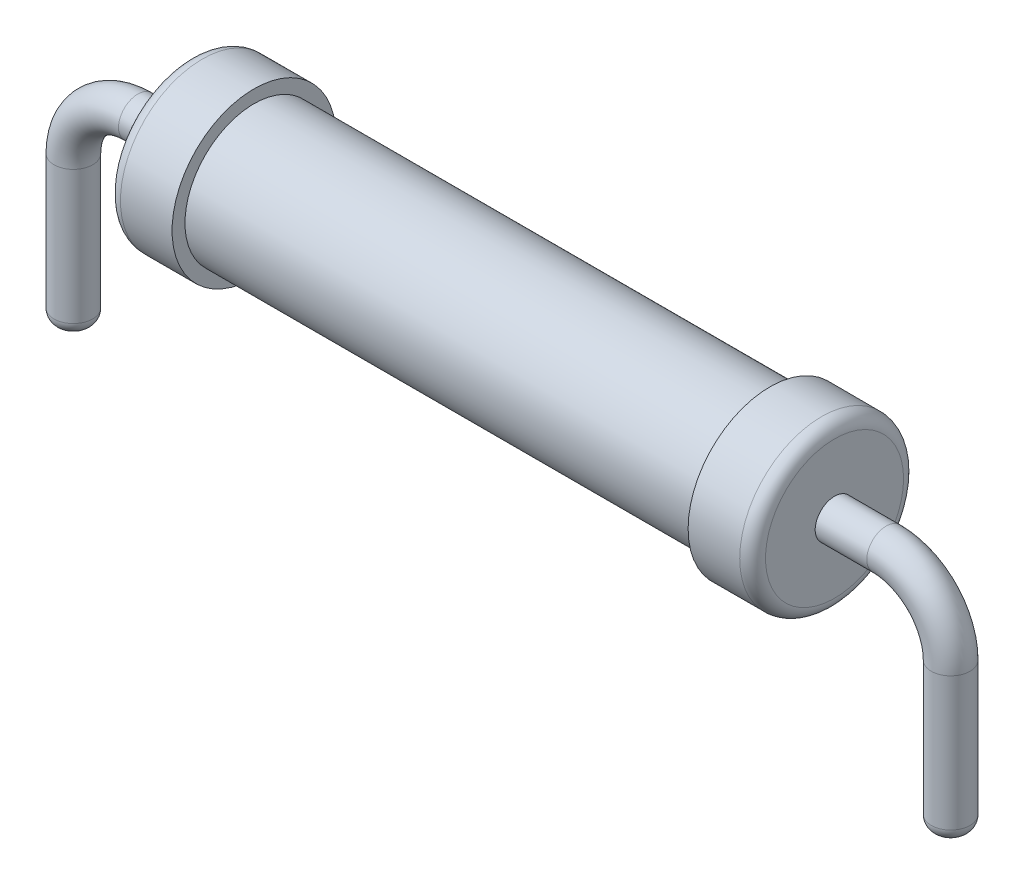
ISO-10303-21;
HEADER;
FILE_DESCRIPTION(('STEP AP214'),'2;1');
FILE_NAME('part.step','',(''),(''),'','','');
FILE_SCHEMA(('AUTOMOTIVE_DESIGN { 1 0 10303 214 1 1 1 1 }'));
ENDSEC;
DATA;
#1=APPLICATION_CONTEXT('core data for automotive mechanical design processes');
#2=APPLICATION_PROTOCOL_DEFINITION('international standard','automotive_design',2000,#1);
#3=PRODUCT_CONTEXT('',#1,'mechanical');
#4=PRODUCT('Part','Part','',(#3));
#5=PRODUCT_RELATED_PRODUCT_CATEGORY('part','',(#4));
#6=PRODUCT_DEFINITION_FORMATION('','',#4);
#7=PRODUCT_DEFINITION_CONTEXT('part definition',#1,'design');
#8=PRODUCT_DEFINITION('design','',#6,#7);
#9=PRODUCT_DEFINITION_SHAPE('','',#8);
#10=(LENGTH_UNIT() NAMED_UNIT(*) SI_UNIT(.MILLI.,.METRE.));
#11=(NAMED_UNIT(*) PLANE_ANGLE_UNIT() SI_UNIT($,.RADIAN.));
#12=(NAMED_UNIT(*) SI_UNIT($,.STERADIAN.) SOLID_ANGLE_UNIT());
#13=UNCERTAINTY_MEASURE_WITH_UNIT(LENGTH_MEASURE(1.E-05),#10,'distance_accuracy_value','');
#14=(GEOMETRIC_REPRESENTATION_CONTEXT(3) GLOBAL_UNCERTAINTY_ASSIGNED_CONTEXT((#13)) GLOBAL_UNIT_ASSIGNED_CONTEXT((#10,
#11,#12)) REPRESENTATION_CONTEXT('',''));
#15=CARTESIAN_POINT('',(0.,0.,0.));
#16=DIRECTION('',(0.,0.,1.));
#17=DIRECTION('',(1.,0.,0.));
#18=AXIS2_PLACEMENT_3D('',#15,#16,#17);
#19=CARTESIAN_POINT('',(5.,0.,0.));
#20=DIRECTION('',(-1.,0.,0.));
#21=DIRECTION('',(0.,0.,1.));
#22=AXIS2_PLACEMENT_3D('',#19,#20,#21);
#23=CYLINDRICAL_SURFACE('',#22,1.27);
#24=CARTESIAN_POINT('',(-4.8,0.,0.));
#25=DIRECTION('',(1.,0.,0.));
#26=DIRECTION('',(0.,0.,-1.));
#27=AXIS2_PLACEMENT_3D('',#24,#25,#26);
#28=CIRCLE('',#27,1.27);
#29=CARTESIAN_POINT('',(-4.8,0.,-1.27));
#30=VERTEX_POINT('',#29);
#31=EDGE_CURVE('E86',#30,#30,#28,.T.);
#32=ORIENTED_EDGE('',*,*,#31,.T.);
#33=EDGE_LOOP('',(#32));
#34=FACE_BOUND('',#33,.T.);
#35=CARTESIAN_POINT('',(-4.,0.,0.));
#36=DIRECTION('',(1.,0.,0.));
#37=DIRECTION('',(0.,0.,-1.));
#38=AXIS2_PLACEMENT_3D('',#35,#36,#37);
#39=CIRCLE('',#38,1.27);
#40=CARTESIAN_POINT('',(-4.,0.,-1.27));
#41=VERTEX_POINT('',#40);
#42=EDGE_CURVE('E37',#41,#41,#39,.T.);
#43=ORIENTED_EDGE('',*,*,#42,.F.);
#44=EDGE_LOOP('',(#43));
#45=FACE_BOUND('',#44,.T.);
#46=ADVANCED_FACE('F33',(#34,#45),#23,.T.);
#47=CARTESIAN_POINT('',(-5.,0.,0.));
#48=DIRECTION('',(1.,0.,0.));
#49=DIRECTION('',(0.,0.,-1.));
#50=AXIS2_PLACEMENT_3D('',#47,#48,#49);
#51=PLANE('',#50);
#52=CARTESIAN_POINT('',(-5.,0.,0.));
#53=DIRECTION('',(1.,0.,0.));
#54=DIRECTION('',(0.,0.,-1.));
#55=AXIS2_PLACEMENT_3D('',#52,#53,#54);
#56=CIRCLE('',#55,0.3);
#57=CARTESIAN_POINT('',(-5.,0.,-0.3));
#58=VERTEX_POINT('',#57);
#59=EDGE_CURVE('E55',#58,#58,#56,.F.);
#60=ORIENTED_EDGE('',*,*,#59,.F.);
#61=EDGE_LOOP('',(#60));
#62=FACE_BOUND('',#61,.T.);
#63=CARTESIAN_POINT('',(-5.,0.,0.));
#64=DIRECTION('',(1.,0.,0.));
#65=DIRECTION('',(0.,0.,-1.));
#66=AXIS2_PLACEMENT_3D('',#63,#64,#65);
#67=CIRCLE('',#66,1.07);
#68=CARTESIAN_POINT('',(-5.,0.,-1.07));
#69=VERTEX_POINT('',#68);
#70=EDGE_CURVE('E89',#69,#69,#67,.F.);
#71=ORIENTED_EDGE('',*,*,#70,.T.);
#72=EDGE_LOOP('',(#71));
#73=FACE_BOUND('',#72,.T.);
#74=ADVANCED_FACE('F119',(#62,#73),#51,.F.);
#75=CARTESIAN_POINT('',(-4.8,0.,0.));
#76=DIRECTION('',(1.,0.,0.));
#77=DIRECTION('',(0.,0.,-1.));
#78=AXIS2_PLACEMENT_3D('',#75,#76,#77);
#79=TOROIDAL_SURFACE('',#78,1.07,0.2);
#80=ORIENTED_EDGE('',*,*,#70,.F.);
#81=EDGE_LOOP('',(#80));
#82=FACE_BOUND('',#81,.T.);
#83=ORIENTED_EDGE('',*,*,#31,.F.);
#84=EDGE_LOOP('',(#83));
#85=FACE_BOUND('',#84,.T.);
#86=ADVANCED_FACE('F126',(#82,#85),#79,.T.);
#87=CARTESIAN_POINT('',(-6.8,-3.27,0.));
#88=DIRECTION('',(0.,-1.,0.));
#89=DIRECTION('',(0.,0.,-1.));
#90=AXIS2_PLACEMENT_3D('',#87,#88,#89);
#91=PLANE('',#90);
#92=CARTESIAN_POINT('',(-6.8,-3.27,0.));
#93=DIRECTION('',(0.,-1.,0.));
#94=DIRECTION('',(0.,0.,-1.));
#95=AXIS2_PLACEMENT_3D('',#92,#93,#94);
#96=CIRCLE('',#95,0.1);
#97=CARTESIAN_POINT('',(-6.8,-3.27,-0.1));
#98=VERTEX_POINT('',#97);
#99=EDGE_CURVE('E41',#98,#98,#96,.T.);
#100=ORIENTED_EDGE('',*,*,#99,.T.);
#101=EDGE_LOOP('',(#100));
#102=FACE_BOUND('',#101,.T.);
#103=ADVANCED_FACE('F163',(#102),#91,.T.);
#104=CARTESIAN_POINT('',(-5.,0.,0.));
#105=DIRECTION('',(-1.,0.,0.));
#106=DIRECTION('',(0.,0.,1.));
#107=AXIS2_PLACEMENT_3D('',#104,#105,#106);
#108=CYLINDRICAL_SURFACE('',#107,0.3);
#109=CARTESIAN_POINT('',(-5.79999999999999,0.,0.));
#110=DIRECTION('',(1.,0.,0.));
#111=DIRECTION('',(0.,0.,-1.));
#112=AXIS2_PLACEMENT_3D('',#109,#110,#111);
#113=CIRCLE('',#112,0.3);
#114=CARTESIAN_POINT('',(-5.79999999999999,0.299999999999965,0.));
#115=VERTEX_POINT('',#114);
#116=EDGE_CURVE('E66',#115,#115,#113,.F.);
#117=ORIENTED_EDGE('',*,*,#116,.F.);
#118=EDGE_LOOP('',(#117));
#119=FACE_BOUND('',#118,.T.);
#120=ORIENTED_EDGE('',*,*,#59,.T.);
#121=EDGE_LOOP('',(#120));
#122=FACE_BOUND('',#121,.T.);
#123=ADVANCED_FACE('F216',(#119,#122),#108,.T.);
#124=CARTESIAN_POINT('',(-5.8,-1.,0.));
#125=DIRECTION('',(0.,0.,1.));
#126=DIRECTION('',(1.,0.,0.));
#127=AXIS2_PLACEMENT_3D('',#124,#125,#126);
#128=TOROIDAL_SURFACE('',#127,0.999999999999965,0.3);
#129=CARTESIAN_POINT('',(-6.8,-1.,0.));
#130=DIRECTION('',(0.,1.,0.));
#131=DIRECTION('',(0.,0.,-1.));
#132=AXIS2_PLACEMENT_3D('',#129,#130,#131);
#133=CIRCLE('',#132,0.3);
#134=CARTESIAN_POINT('',(-7.09999999999997,-1.,0.));
#135=VERTEX_POINT('',#134);
#136=EDGE_CURVE('E69',#135,#135,#133,.F.);
#137=CARTESIAN_POINT('',(-5.8,-1.,0.));
#138=DIRECTION('',(0.,0.,1.));
#139=DIRECTION('',(1.,0.,0.));
#140=AXIS2_PLACEMENT_3D('',#137,#138,#139);
#141=CIRCLE('',#140,1.29999999999997);
#142=EDGE_CURVE('',#115,#135,#141,.T.);
#143=ORIENTED_EDGE('',*,*,#116,.T.);
#144=ORIENTED_EDGE('',*,*,#136,.F.);
#145=ORIENTED_EDGE('',*,*,#142,.T.);
#146=ORIENTED_EDGE('',*,*,#142,.F.);
#147=EDGE_LOOP('',(#143,#145,#144,#146));
#148=FACE_BOUND('',#147,.T.);
#149=ADVANCED_FACE('F225',(#148),#128,.T.);
#150=CARTESIAN_POINT('',(-6.8,-1.00000000000001,0.));
#151=DIRECTION('',(0.,-1.,0.));
#152=DIRECTION('',(0.,0.,-1.));
#153=AXIS2_PLACEMENT_3D('',#150,#151,#152);
#154=CYLINDRICAL_SURFACE('',#153,0.3);
#155=CARTESIAN_POINT('',(-6.8,-3.07,0.));
#156=DIRECTION('',(0.,-1.,0.));
#157=DIRECTION('',(0.,0.,-1.));
#158=AXIS2_PLACEMENT_3D('',#155,#156,#157);
#159=CIRCLE('',#158,0.3);
#160=CARTESIAN_POINT('',(-6.8,-3.07,-0.3));
#161=VERTEX_POINT('',#160);
#162=EDGE_CURVE('E10',#161,#161,#159,.F.);
#163=ORIENTED_EDGE('',*,*,#162,.T.);
#164=EDGE_LOOP('',(#163));
#165=FACE_BOUND('',#164,.T.);
#166=ORIENTED_EDGE('',*,*,#136,.T.);
#167=EDGE_LOOP('',(#166));
#168=FACE_BOUND('',#167,.T.);
#169=ADVANCED_FACE('F198',(#165,#168),#154,.T.);
#170=CARTESIAN_POINT('',(-6.8,-3.07,0.));
#171=DIRECTION('',(0.,-1.,0.));
#172=DIRECTION('',(0.,0.,-1.));
#173=AXIS2_PLACEMENT_3D('',#170,#171,#172);
#174=DEGENERATE_TOROIDAL_SURFACE('',#173,0.1,0.2,.T.);
#175=ORIENTED_EDGE('',*,*,#162,.F.);
#176=EDGE_LOOP('',(#175));
#177=FACE_BOUND('',#176,.T.);
#178=ORIENTED_EDGE('',*,*,#99,.F.);
#179=EDGE_LOOP('',(#178));
#180=FACE_BOUND('',#179,.T.);
#181=ADVANCED_FACE('F35',(#177,#180),#174,.T.);
#182=CARTESIAN_POINT('',(-4.,0.,1.07));
#183=DIRECTION('',(1.,0.,0.));
#184=DIRECTION('',(0.,0.,-1.));
#185=AXIS2_PLACEMENT_3D('',#182,#183,#184);
#186=PLANE('',#185);
#187=CARTESIAN_POINT('',(-4.,0.,0.));
#188=DIRECTION('',(1.,0.,0.));
#189=DIRECTION('',(0.,0.,-1.));
#190=AXIS2_PLACEMENT_3D('',#187,#188,#189);
#191=CIRCLE('',#190,1.07);
#192=CARTESIAN_POINT('',(-4.,0.,-1.07));
#193=VERTEX_POINT('',#192);
#194=EDGE_CURVE('E57',#193,#193,#191,.T.);
#195=ORIENTED_EDGE('',*,*,#194,.F.);
#196=EDGE_LOOP('',(#195));
#197=FACE_BOUND('',#196,.T.);
#198=ORIENTED_EDGE('',*,*,#42,.T.);
#199=EDGE_LOOP('',(#198));
#200=FACE_BOUND('',#199,.T.);
#201=ADVANCED_FACE('F250',(#197,#200),#186,.T.);
#202=CARTESIAN_POINT('',(4.,0.,1.07));
#203=DIRECTION('',(-1.,0.,0.));
#204=DIRECTION('',(0.,0.,1.));
#205=AXIS2_PLACEMENT_3D('',#202,#203,#204);
#206=PLANE('',#205);
#207=CARTESIAN_POINT('',(4.,0.,0.));
#208=DIRECTION('',(1.,0.,0.));
#209=DIRECTION('',(0.,0.,-1.));
#210=AXIS2_PLACEMENT_3D('',#207,#208,#209);
#211=CIRCLE('',#210,1.07);
#212=CARTESIAN_POINT('',(4.,0.,-1.07));
#213=VERTEX_POINT('',#212);
#214=EDGE_CURVE('E51',#213,#213,#211,.T.);
#215=ORIENTED_EDGE('',*,*,#214,.T.);
#216=EDGE_LOOP('',(#215));
#217=FACE_BOUND('',#216,.T.);
#218=CARTESIAN_POINT('',(4.,0.,0.));
#219=DIRECTION('',(-1.,0.,0.));
#220=DIRECTION('',(0.,0.,1.));
#221=AXIS2_PLACEMENT_3D('',#218,#219,#220);
#222=CIRCLE('',#221,1.27);
#223=CARTESIAN_POINT('',(4.,0.,1.27));
#224=VERTEX_POINT('',#223);
#225=EDGE_CURVE('E49',#224,#224,#222,.T.);
#226=ORIENTED_EDGE('',*,*,#225,.T.);
#227=EDGE_LOOP('',(#226));
#228=FACE_BOUND('',#227,.T.);
#229=ADVANCED_FACE('F113',(#217,#228),#206,.T.);
#230=CARTESIAN_POINT('',(7.81,0.,0.));
#231=DIRECTION('',(1.,0.,0.));
#232=DIRECTION('',(0.,0.,-1.));
#233=AXIS2_PLACEMENT_3D('',#230,#231,#232);
#234=CYLINDRICAL_SURFACE('',#233,1.07);
#235=ORIENTED_EDGE('',*,*,#194,.T.);
#236=EDGE_LOOP('',(#235));
#237=FACE_BOUND('',#236,.T.);
#238=ORIENTED_EDGE('',*,*,#214,.F.);
#239=EDGE_LOOP('',(#238));
#240=FACE_BOUND('',#239,.T.);
#241=ADVANCED_FACE('F108',(#237,#240),#234,.T.);
#242=CARTESIAN_POINT('',(6.8,-3.27,0.));
#243=DIRECTION('',(0.,-1.,0.));
#244=DIRECTION('',(0.,0.,-1.));
#245=AXIS2_PLACEMENT_3D('',#242,#243,#244);
#246=PLANE('',#245);
#247=CARTESIAN_POINT('',(6.8,-3.27,0.));
#248=DIRECTION('',(0.,-1.,0.));
#249=DIRECTION('',(0.,0.,-1.));
#250=AXIS2_PLACEMENT_3D('',#247,#248,#249);
#251=CIRCLE('',#250,0.1);
#252=CARTESIAN_POINT('',(6.8,-3.27,-0.1));
#253=VERTEX_POINT('',#252);
#254=EDGE_CURVE('E76',#253,#253,#251,.T.);
#255=ORIENTED_EDGE('',*,*,#254,.T.);
#256=EDGE_LOOP('',(#255));
#257=FACE_BOUND('',#256,.T.);
#258=ADVANCED_FACE('F104',(#257),#246,.T.);
#259=CARTESIAN_POINT('',(6.8,-3.07,0.));
#260=DIRECTION('',(0.,-1.,0.));
#261=DIRECTION('',(0.,0.,-1.));
#262=AXIS2_PLACEMENT_3D('',#259,#260,#261);
#263=DEGENERATE_TOROIDAL_SURFACE('',#262,0.1,0.2,.T.);
#264=CARTESIAN_POINT('',(6.8,-3.07,0.));
#265=DIRECTION('',(0.,-1.,0.));
#266=DIRECTION('',(0.,0.,-1.));
#267=AXIS2_PLACEMENT_3D('',#264,#265,#266);
#268=CIRCLE('',#267,0.3);
#269=CARTESIAN_POINT('',(6.8,-3.07,-0.3));
#270=VERTEX_POINT('',#269);
#271=EDGE_CURVE('E46',#270,#270,#268,.F.);
#272=ORIENTED_EDGE('',*,*,#271,.F.);
#273=EDGE_LOOP('',(#272));
#274=FACE_BOUND('',#273,.T.);
#275=ORIENTED_EDGE('',*,*,#254,.F.);
#276=EDGE_LOOP('',(#275));
#277=FACE_BOUND('',#276,.T.);
#278=ADVANCED_FACE('F101',(#274,#277),#263,.T.);
#279=CARTESIAN_POINT('',(6.8,-1.00000000000001,0.));
#280=DIRECTION('',(0.,-1.,0.));
#281=DIRECTION('',(0.,0.,-1.));
#282=AXIS2_PLACEMENT_3D('',#279,#280,#281);
#283=CYLINDRICAL_SURFACE('',#282,0.3);
#284=ORIENTED_EDGE('',*,*,#271,.T.);
#285=EDGE_LOOP('',(#284));
#286=FACE_BOUND('',#285,.T.);
#287=CARTESIAN_POINT('',(6.8,-1.,0.));
#288=DIRECTION('',(0.,-1.,0.));
#289=DIRECTION('',(0.,0.,-1.));
#290=AXIS2_PLACEMENT_3D('',#287,#288,#289);
#291=CIRCLE('',#290,0.3);
#292=CARTESIAN_POINT('',(7.09999999999997,-1.,0.));
#293=VERTEX_POINT('',#292);
#294=EDGE_CURVE('E80',#293,#293,#291,.T.);
#295=ORIENTED_EDGE('',*,*,#294,.T.);
#296=EDGE_LOOP('',(#295));
#297=FACE_BOUND('',#296,.T.);
#298=ADVANCED_FACE('F98',(#286,#297),#283,.T.);
#299=CARTESIAN_POINT('',(5.8,-1.,0.));
#300=DIRECTION('',(0.,0.,-1.));
#301=DIRECTION('',(-1.,0.,0.));
#302=AXIS2_PLACEMENT_3D('',#299,#300,#301);
#303=TOROIDAL_SURFACE('',#302,0.999999999999965,0.3);
#304=CARTESIAN_POINT('',(5.79999999999999,0.,0.));
#305=DIRECTION('',(1.,0.,0.));
#306=DIRECTION('',(0.,0.,-1.));
#307=AXIS2_PLACEMENT_3D('',#304,#305,#306);
#308=CIRCLE('',#307,0.3);
#309=CARTESIAN_POINT('',(5.79999999999999,0.299999999999965,0.));
#310=VERTEX_POINT('',#309);
#311=EDGE_CURVE('E72',#310,#310,#308,.T.);
#312=CARTESIAN_POINT('',(5.8,-1.,0.));
#313=DIRECTION('',(0.,0.,-1.));
#314=DIRECTION('',(-1.,0.,0.));
#315=AXIS2_PLACEMENT_3D('',#312,#313,#314);
#316=CIRCLE('',#315,1.29999999999997);
#317=EDGE_CURVE('',#310,#293,#316,.T.);
#318=ORIENTED_EDGE('',*,*,#311,.T.);
#319=ORIENTED_EDGE('',*,*,#294,.F.);
#320=ORIENTED_EDGE('',*,*,#317,.T.);
#321=ORIENTED_EDGE('',*,*,#317,.F.);
#322=EDGE_LOOP('',(#318,#320,#319,#321));
#323=FACE_BOUND('',#322,.T.);
#324=ADVANCED_FACE('F151',(#323),#303,.T.);
#325=CARTESIAN_POINT('',(5.,0.,0.));
#326=DIRECTION('',(1.,0.,0.));
#327=DIRECTION('',(0.,0.,-1.));
#328=AXIS2_PLACEMENT_3D('',#325,#326,#327);
#329=CYLINDRICAL_SURFACE('',#328,0.3);
#330=ORIENTED_EDGE('',*,*,#311,.F.);
#331=EDGE_LOOP('',(#330));
#332=FACE_BOUND('',#331,.T.);
#333=CARTESIAN_POINT('',(5.,0.,0.));
#334=DIRECTION('',(1.,0.,0.));
#335=DIRECTION('',(0.,0.,-1.));
#336=AXIS2_PLACEMENT_3D('',#333,#334,#335);
#337=CIRCLE('',#336,0.3);
#338=CARTESIAN_POINT('',(5.,0.,-0.3));
#339=VERTEX_POINT('',#338);
#340=EDGE_CURVE('E73',#339,#339,#337,.T.);
#341=ORIENTED_EDGE('',*,*,#340,.T.);
#342=EDGE_LOOP('',(#341));
#343=FACE_BOUND('',#342,.T.);
#344=ADVANCED_FACE('F146',(#332,#343),#329,.T.);
#345=CARTESIAN_POINT('',(5.,0.,0.));
#346=DIRECTION('',(1.,0.,0.));
#347=DIRECTION('',(0.,0.,-1.));
#348=AXIS2_PLACEMENT_3D('',#345,#346,#347);
#349=PLANE('',#348);
#350=ORIENTED_EDGE('',*,*,#340,.F.);
#351=EDGE_LOOP('',(#350));
#352=FACE_BOUND('',#351,.T.);
#353=CARTESIAN_POINT('',(5.,0.,0.));
#354=DIRECTION('',(1.,0.,0.));
#355=DIRECTION('',(0.,0.,-1.));
#356=AXIS2_PLACEMENT_3D('',#353,#354,#355);
#357=CIRCLE('',#356,1.07);
#358=CARTESIAN_POINT('',(5.,0.,-1.07));
#359=VERTEX_POINT('',#358);
#360=EDGE_CURVE('E77',#359,#359,#357,.T.);
#361=ORIENTED_EDGE('',*,*,#360,.T.);
#362=EDGE_LOOP('',(#361));
#363=FACE_BOUND('',#362,.T.);
#364=ADVANCED_FACE('F137',(#352,#363),#349,.T.);
#365=CARTESIAN_POINT('',(4.8,0.,0.));
#366=DIRECTION('',(1.,0.,0.));
#367=DIRECTION('',(0.,0.,-1.));
#368=AXIS2_PLACEMENT_3D('',#365,#366,#367);
#369=TOROIDAL_SURFACE('',#368,1.07,0.2);
#370=CARTESIAN_POINT('',(4.8,0.,0.));
#371=DIRECTION('',(1.,0.,0.));
#372=DIRECTION('',(0.,0.,-1.));
#373=AXIS2_PLACEMENT_3D('',#370,#371,#372);
#374=CIRCLE('',#373,1.27);
#375=CARTESIAN_POINT('',(4.8,0.,-1.27));
#376=VERTEX_POINT('',#375);
#377=EDGE_CURVE('E83',#376,#376,#374,.F.);
#378=ORIENTED_EDGE('',*,*,#377,.F.);
#379=EDGE_LOOP('',(#378));
#380=FACE_BOUND('',#379,.T.);
#381=ORIENTED_EDGE('',*,*,#360,.F.);
#382=EDGE_LOOP('',(#381));
#383=FACE_BOUND('',#382,.T.);
#384=ADVANCED_FACE('F132',(#380,#383),#369,.T.);
#385=ORIENTED_EDGE('',*,*,#377,.T.);
#386=EDGE_LOOP('',(#385));
#387=FACE_BOUND('',#386,.T.);
#388=ORIENTED_EDGE('',*,*,#225,.F.);
#389=EDGE_LOOP('',(#388));
#390=FACE_BOUND('',#389,.T.);
#391=ADVANCED_FACE('F122',(#387,#390),#23,.T.);
#392=CLOSED_SHELL('',(#46,#74,#86,#103,#123,#149,#169,#181,#201,#229,#241,#258,#278,#298,#324,
#344,#364,#384,#391));
#393=MANIFOLD_SOLID_BREP('B2',#392);
#394=ADVANCED_BREP_SHAPE_REPRESENTATION('',(#18,#393),#14);
#395=SHAPE_DEFINITION_REPRESENTATION(#9,#394);
ENDSEC;
END-ISO-10303-21;
